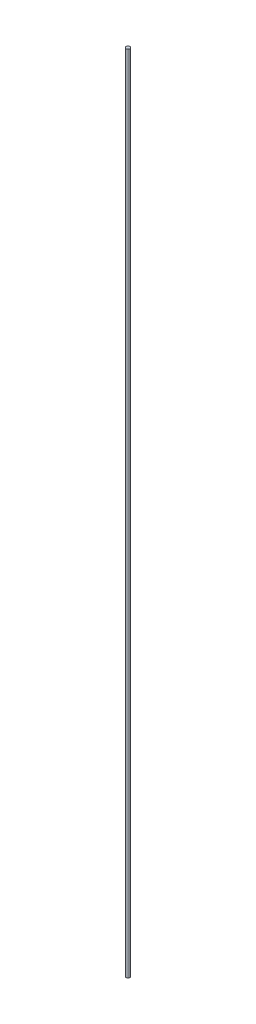
ISO-10303-21;
HEADER;
FILE_DESCRIPTION(('STEP AP214'),'2;1');
FILE_NAME('part.step','',(''),(''),'','','');
FILE_SCHEMA(('AUTOMOTIVE_DESIGN { 1 0 10303 214 1 1 1 1 }'));
ENDSEC;
DATA;
#1=APPLICATION_CONTEXT('core data for automotive mechanical design processes');
#2=APPLICATION_PROTOCOL_DEFINITION('international standard','automotive_design',2000,#1);
#3=PRODUCT_CONTEXT('',#1,'mechanical');
#4=PRODUCT('Part','Part','',(#3));
#5=PRODUCT_RELATED_PRODUCT_CATEGORY('part','',(#4));
#6=PRODUCT_DEFINITION_FORMATION('','',#4);
#7=PRODUCT_DEFINITION_CONTEXT('part definition',#1,'design');
#8=PRODUCT_DEFINITION('design','',#6,#7);
#9=PRODUCT_DEFINITION_SHAPE('','',#8);
#10=(LENGTH_UNIT() NAMED_UNIT(*) SI_UNIT(.MILLI.,.METRE.));
#11=(NAMED_UNIT(*) PLANE_ANGLE_UNIT() SI_UNIT($,.RADIAN.));
#12=(NAMED_UNIT(*) SI_UNIT($,.STERADIAN.) SOLID_ANGLE_UNIT());
#13=UNCERTAINTY_MEASURE_WITH_UNIT(LENGTH_MEASURE(1.E-05),#10,'distance_accuracy_value','');
#14=(GEOMETRIC_REPRESENTATION_CONTEXT(3) GLOBAL_UNCERTAINTY_ASSIGNED_CONTEXT((#13)) GLOBAL_UNIT_ASSIGNED_CONTEXT((#10,
#11,#12)) REPRESENTATION_CONTEXT('',''));
#15=CARTESIAN_POINT('',(0.,0.,0.));
#16=DIRECTION('',(0.,0.,1.));
#17=DIRECTION('',(1.,0.,0.));
#18=AXIS2_PLACEMENT_3D('',#15,#16,#17);
#19=CARTESIAN_POINT('',(0.,1000.,0.));
#20=DIRECTION('',(0.,-1.,0.));
#21=DIRECTION('',(0.,0.,-1.));
#22=AXIS2_PLACEMENT_3D('',#19,#20,#21);
#23=CYLINDRICAL_SURFACE('',#22,2.38125);
#24=CARTESIAN_POINT('',(0.,1000.,0.));
#25=DIRECTION('',(0.,1.,0.));
#26=DIRECTION('',(0.,0.,1.));
#27=AXIS2_PLACEMENT_3D('',#24,#25,#26);
#28=CIRCLE('',#27,2.38125);
#29=CARTESIAN_POINT('',(0.,1000.,2.38125));
#30=VERTEX_POINT('',#29);
#31=EDGE_CURVE('E10',#30,#30,#28,.T.);
#32=ORIENTED_EDGE('',*,*,#31,.F.);
#33=EDGE_LOOP('',(#32));
#34=FACE_BOUND('',#33,.T.);
#35=CARTESIAN_POINT('',(0.,0.,0.));
#36=DIRECTION('',(0.,1.,0.));
#37=DIRECTION('',(0.,0.,1.));
#38=AXIS2_PLACEMENT_3D('',#35,#36,#37);
#39=CIRCLE('',#38,2.38125);
#40=CARTESIAN_POINT('',(0.,0.,2.38125));
#41=VERTEX_POINT('',#40);
#42=EDGE_CURVE('E36',#41,#41,#39,.T.);
#43=ORIENTED_EDGE('',*,*,#42,.T.);
#44=EDGE_LOOP('',(#43));
#45=FACE_BOUND('',#44,.T.);
#46=ADVANCED_FACE('F33',(#34,#45),#23,.T.);
#47=CARTESIAN_POINT('',(0.,1000.,0.));
#48=DIRECTION('',(0.,1.,0.));
#49=DIRECTION('',(0.,0.,1.));
#50=AXIS2_PLACEMENT_3D('',#47,#48,#49);
#51=PLANE('',#50);
#52=ORIENTED_EDGE('',*,*,#31,.T.);
#53=EDGE_LOOP('',(#52));
#54=FACE_BOUND('',#53,.T.);
#55=ADVANCED_FACE('F48',(#54),#51,.T.);
#56=CARTESIAN_POINT('',(0.,0.,0.));
#57=DIRECTION('',(0.,1.,0.));
#58=DIRECTION('',(0.,0.,1.));
#59=AXIS2_PLACEMENT_3D('',#56,#57,#58);
#60=PLANE('',#59);
#61=ORIENTED_EDGE('',*,*,#42,.F.);
#62=EDGE_LOOP('',(#61));
#63=FACE_BOUND('',#62,.T.);
#64=ADVANCED_FACE('F46',(#63),#60,.F.);
#65=CLOSED_SHELL('',(#46,#55,#64));
#66=MANIFOLD_SOLID_BREP('B2',#65);
#67=ADVANCED_BREP_SHAPE_REPRESENTATION('',(#18,#66),#14);
#68=SHAPE_DEFINITION_REPRESENTATION(#9,#67);
ENDSEC;
END-ISO-10303-21;
